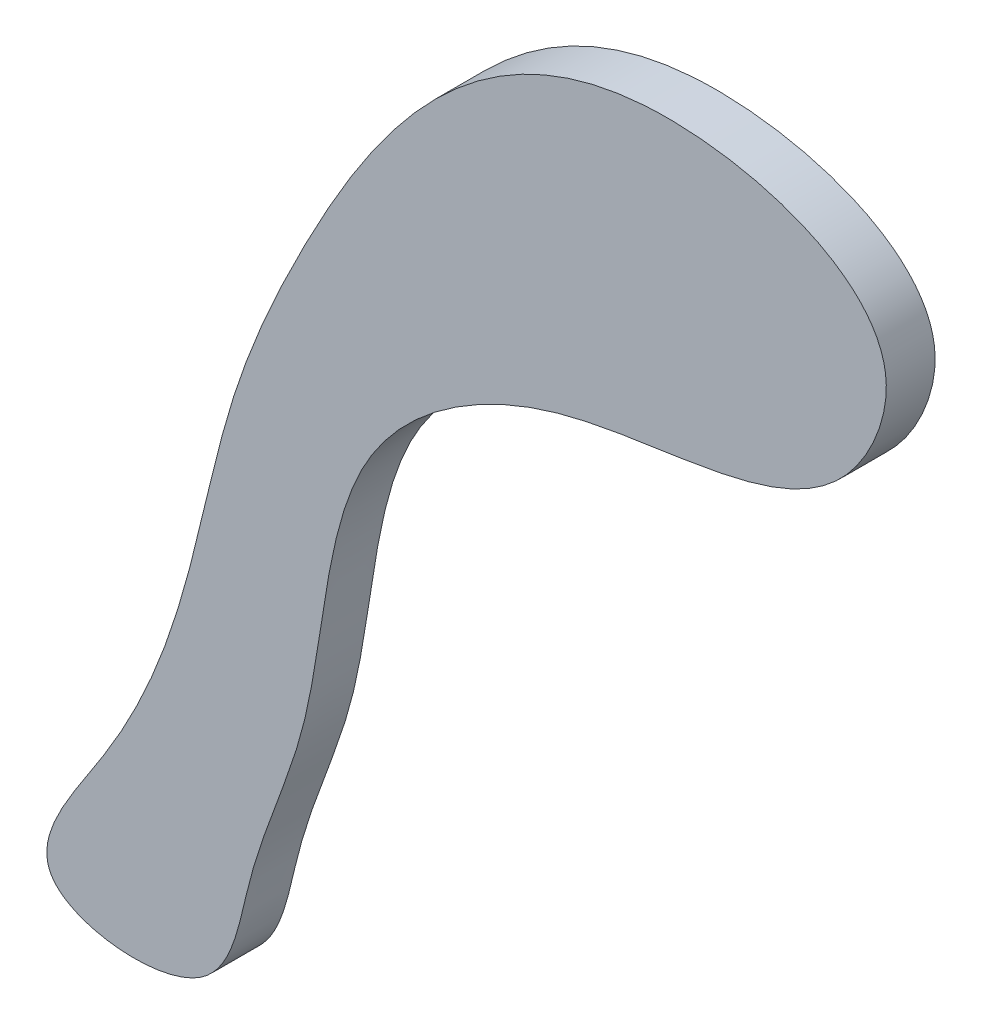
ISO-10303-21;
HEADER;
FILE_DESCRIPTION(('STEP AP214'),'2;1');
FILE_NAME('part.step','',(''),(''),'','','');
FILE_SCHEMA(('AUTOMOTIVE_DESIGN { 1 0 10303 214 1 1 1 1 }'));
ENDSEC;
DATA;
#1=APPLICATION_CONTEXT('core data for automotive mechanical design processes');
#2=APPLICATION_PROTOCOL_DEFINITION('international standard','automotive_design',2000,#1);
#3=PRODUCT_CONTEXT('',#1,'mechanical');
#4=PRODUCT('Part','Part','',(#3));
#5=PRODUCT_RELATED_PRODUCT_CATEGORY('part','',(#4));
#6=PRODUCT_DEFINITION_FORMATION('','',#4);
#7=PRODUCT_DEFINITION_CONTEXT('part definition',#1,'design');
#8=PRODUCT_DEFINITION('design','',#6,#7);
#9=PRODUCT_DEFINITION_SHAPE('','',#8);
#10=(LENGTH_UNIT() NAMED_UNIT(*) SI_UNIT(.MILLI.,.METRE.));
#11=(NAMED_UNIT(*) PLANE_ANGLE_UNIT() SI_UNIT($,.RADIAN.));
#12=(NAMED_UNIT(*) SI_UNIT($,.STERADIAN.) SOLID_ANGLE_UNIT());
#13=UNCERTAINTY_MEASURE_WITH_UNIT(LENGTH_MEASURE(1.E-05),#10,'distance_accuracy_value','');
#14=(GEOMETRIC_REPRESENTATION_CONTEXT(3) GLOBAL_UNCERTAINTY_ASSIGNED_CONTEXT((#13)) GLOBAL_UNIT_ASSIGNED_CONTEXT((#10,
#11,#12)) REPRESENTATION_CONTEXT('',''));
#15=CARTESIAN_POINT('',(0.,0.,0.));
#16=DIRECTION('',(0.,0.,1.));
#17=DIRECTION('',(1.,0.,0.));
#18=AXIS2_PLACEMENT_3D('',#15,#16,#17);
#19=CARTESIAN_POINT('',(-342.579158769949,136.389310292418,7.60003015396286));
#20=CARTESIAN_POINT('',(-343.280735479312,136.340510122286,7.60003015396286));
#21=CARTESIAN_POINT('',(-343.825711481738,135.541647110917,7.60003015396286));
#22=CARTESIAN_POINT('',(-344.404596185204,134.256950011767,7.60003015396286));
#23=CARTESIAN_POINT('',(-344.435078204899,133.383444524225,7.60003015396286));
#24=CARTESIAN_POINT('',(-345.257483164633,132.344504920981,7.60003015396286));
#25=CARTESIAN_POINT('',(-344.288525017137,132.245425638268,7.60003015396286));
#26=CARTESIAN_POINT('',(-344.202696227682,132.916268166575,7.60003015396286));
#27=CARTESIAN_POINT('',(-343.876082740186,133.57355230172,7.60003015396286));
#28=CARTESIAN_POINT('',(-343.899925078437,134.597654628889,7.60003015396286));
#29=CARTESIAN_POINT('',(-342.872004816637,135.289808636034,7.60003015396286));
#30=CARTESIAN_POINT('',(-341.818022304921,135.165465306786,7.60003015396286));
#31=CARTESIAN_POINT('',(-341.416310347144,136.197074856613,7.60003015396286));
#32=CARTESIAN_POINT('',(-342.154516427112,136.41884750239,7.60003015396286));
#33=CARTESIAN_POINT('',(-342.579158769949,136.389310292418,7.60003015396286));
#34=B_SPLINE_CURVE_WITH_KNOTS('',3,(#19,#20,#21,#22,#23,#24,#25,#26,#27,#28,#29,#30,#31,#32,
#33),.UNSPECIFIED.,.T.,.F.,(4,1,1,1,1,1,1,1,1,1,1,1,4),(0.,0.159177830000064,0.222571778534528,
0.367294655292266,0.418107249673309,0.471783736478388,0.513301840180607,0.572978205833702,
0.671765174880242,0.755128356265424,0.868017243335042,0.90365465991559,1.),.UNSPECIFIED.);
#35=DIRECTION('',(0.,0.,-1.));
#36=VECTOR('',#35,1.);
#37=SURFACE_OF_LINEAR_EXTRUSION('',#34,#36);
#38=CARTESIAN_POINT('',(-342.579158769949,136.389310292418,7.60003015396286));
#39=VERTEX_POINT('',#38);
#40=EDGE_CURVE('E10',#39,#39,#34,.T.);
#41=ORIENTED_EDGE('',*,*,#40,.F.);
#42=EDGE_LOOP('',(#41));
#43=FACE_BOUND('',#42,.T.);
#44=CARTESIAN_POINT('',(-342.579158769949,136.389310292418,7.40003015396286));
#45=CARTESIAN_POINT('',(-343.280735479312,136.340510122286,7.40003015396286));
#46=CARTESIAN_POINT('',(-343.825711481738,135.541647110917,7.40003015396286));
#47=CARTESIAN_POINT('',(-344.404596185204,134.256950011767,7.40003015396286));
#48=CARTESIAN_POINT('',(-344.435078204899,133.383444524225,7.40003015396286));
#49=CARTESIAN_POINT('',(-345.257483164633,132.344504920981,7.40003015396286));
#50=CARTESIAN_POINT('',(-344.288525017137,132.245425638268,7.40003015396286));
#51=CARTESIAN_POINT('',(-344.202696227682,132.916268166575,7.40003015396286));
#52=CARTESIAN_POINT('',(-343.876082740186,133.57355230172,7.40003015396286));
#53=CARTESIAN_POINT('',(-343.899925078437,134.597654628889,7.40003015396286));
#54=CARTESIAN_POINT('',(-342.872004816637,135.289808636034,7.40003015396286));
#55=CARTESIAN_POINT('',(-341.818022304921,135.165465306786,7.40003015396286));
#56=CARTESIAN_POINT('',(-341.416310347144,136.197074856613,7.40003015396286));
#57=CARTESIAN_POINT('',(-342.154516427112,136.41884750239,7.40003015396286));
#58=CARTESIAN_POINT('',(-342.579158769949,136.389310292418,7.40003015396286));
#59=B_SPLINE_CURVE_WITH_KNOTS('',3,(#44,#45,#46,#47,#48,#49,#50,#51,#52,#53,#54,#55,#56,#57,
#58),.UNSPECIFIED.,.T.,.F.,(4,1,1,1,1,1,1,1,1,1,1,1,4),(0.,0.159177830000064,0.222571778534528,
0.367294655292266,0.418107249673309,0.471783736478388,0.513301840180607,0.572978205833702,
0.671765174880242,0.755128356265424,0.868017243335042,0.90365465991559,1.),.UNSPECIFIED.);
#60=CARTESIAN_POINT('',(-342.579158769949,136.389310292418,7.40003015396286));
#61=VERTEX_POINT('',#60);
#62=EDGE_CURVE('E37',#61,#61,#59,.T.);
#63=ORIENTED_EDGE('',*,*,#62,.T.);
#64=EDGE_LOOP('',(#63));
#65=FACE_BOUND('',#64,.T.);
#66=ADVANCED_FACE('F33',(#43,#65),#37,.F.);
#67=CARTESIAN_POINT('',(-344.232727423161,132.662154396989,7.60003015396286));
#68=DIRECTION('',(0.,0.,-1.));
#69=DIRECTION('',(-1.,0.,0.));
#70=AXIS2_PLACEMENT_3D('',#67,#68,#69);
#71=PLANE('',#70);
#72=ORIENTED_EDGE('',*,*,#40,.T.);
#73=EDGE_LOOP('',(#72));
#74=FACE_BOUND('',#73,.T.);
#75=ADVANCED_FACE('F56',(#74),#71,.F.);
#76=CARTESIAN_POINT('',(-344.232727423161,132.662154396989,7.40003015396286));
#77=DIRECTION('',(0.,0.,-1.));
#78=DIRECTION('',(-1.,0.,0.));
#79=AXIS2_PLACEMENT_3D('',#76,#77,#78);
#80=PLANE('',#79);
#81=ORIENTED_EDGE('',*,*,#62,.F.);
#82=EDGE_LOOP('',(#81));
#83=FACE_BOUND('',#82,.T.);
#84=ADVANCED_FACE('F54',(#83),#80,.T.);
#85=CLOSED_SHELL('',(#66,#75,#84));
#86=MANIFOLD_SOLID_BREP('B2',#85);
#87=ADVANCED_BREP_SHAPE_REPRESENTATION('',(#18,#86),#14);
#88=SHAPE_DEFINITION_REPRESENTATION(#9,#87);
ENDSEC;
END-ISO-10303-21;
